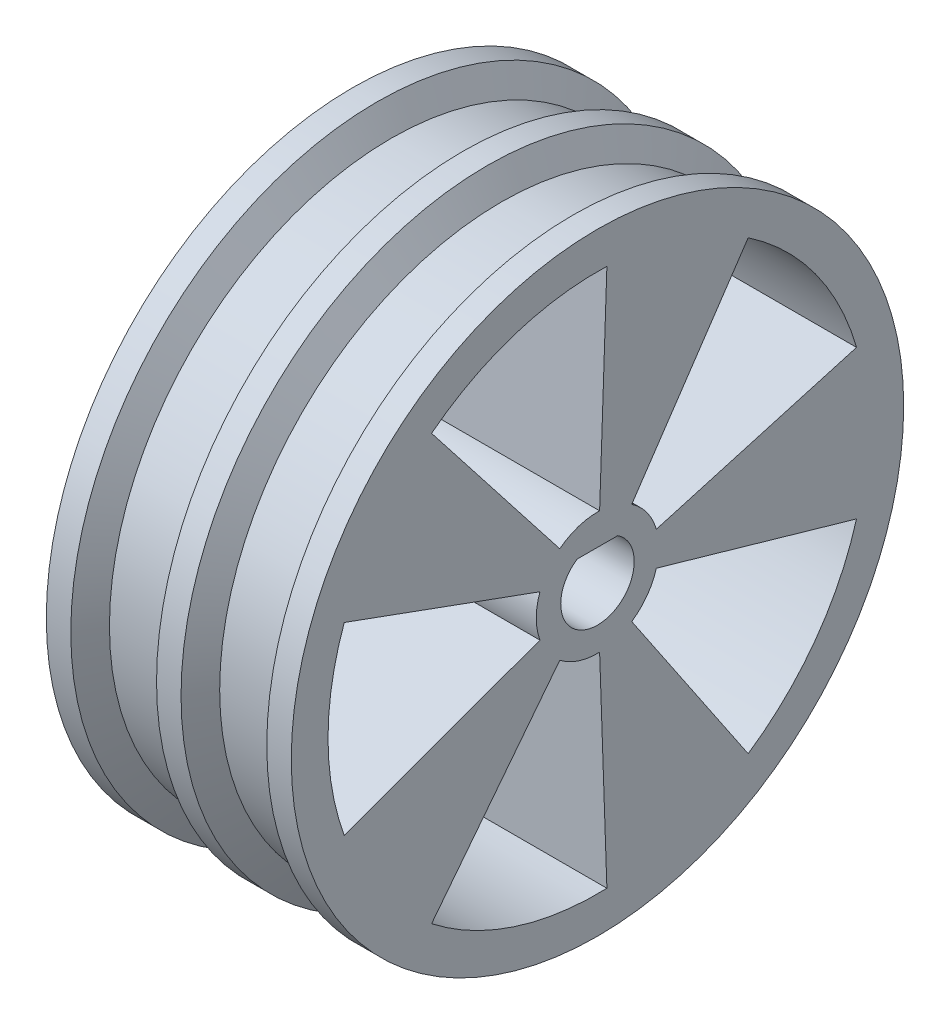
ISO-10303-21;
HEADER;
FILE_DESCRIPTION(('STEP AP214'),'2;1');
FILE_NAME('part.step','',(''),(''),'','','');
FILE_SCHEMA(('AUTOMOTIVE_DESIGN { 1 0 10303 214 1 1 1 1 }'));
ENDSEC;
DATA;
#1=APPLICATION_CONTEXT('core data for automotive mechanical design processes');
#2=APPLICATION_PROTOCOL_DEFINITION('international standard','automotive_design',2000,#1);
#3=PRODUCT_CONTEXT('',#1,'mechanical');
#4=PRODUCT('Part','Part','',(#3));
#5=PRODUCT_RELATED_PRODUCT_CATEGORY('part','',(#4));
#6=PRODUCT_DEFINITION_FORMATION('','',#4);
#7=PRODUCT_DEFINITION_CONTEXT('part definition',#1,'design');
#8=PRODUCT_DEFINITION('design','',#6,#7);
#9=PRODUCT_DEFINITION_SHAPE('','',#8);
#10=(LENGTH_UNIT() NAMED_UNIT(*) SI_UNIT(.MILLI.,.METRE.));
#11=(NAMED_UNIT(*) PLANE_ANGLE_UNIT() SI_UNIT($,.RADIAN.));
#12=(NAMED_UNIT(*) SI_UNIT($,.STERADIAN.) SOLID_ANGLE_UNIT());
#13=UNCERTAINTY_MEASURE_WITH_UNIT(LENGTH_MEASURE(1.E-05),#10,'distance_accuracy_value','');
#14=(GEOMETRIC_REPRESENTATION_CONTEXT(3) GLOBAL_UNCERTAINTY_ASSIGNED_CONTEXT((#13)) GLOBAL_UNIT_ASSIGNED_CONTEXT((#10,
#11,#12)) REPRESENTATION_CONTEXT('',''));
#15=CARTESIAN_POINT('',(0.,0.,0.));
#16=DIRECTION('',(0.,0.,1.));
#17=DIRECTION('',(1.,0.,0.));
#18=AXIS2_PLACEMENT_3D('',#15,#16,#17);
#19=CARTESIAN_POINT('',(-10.,2.5,1.6583123951777));
#20=DIRECTION('',(0.,1.,0.));
#21=DIRECTION('',(0.,0.,1.));
#22=AXIS2_PLACEMENT_3D('',#19,#20,#21);
#23=PLANE('',#22);
#24=DIRECTION('',(0.,0.,1.));
#25=VECTOR('',#24,1.);
#26=CARTESIAN_POINT('',(-6.,2.5,1.6583123951777));
#27=LINE('',#26,#25);
#28=CARTESIAN_POINT('',(-6.,2.5,-1.6583123951777));
#29=VERTEX_POINT('',#28);
#30=CARTESIAN_POINT('',(-6.,2.5,1.6583123951777));
#31=VERTEX_POINT('',#30);
#32=EDGE_CURVE('E227',#29,#31,#27,.T.);
#33=ORIENTED_EDGE('',*,*,#32,.F.);
#34=DIRECTION('',(1.,0.,0.));
#35=VECTOR('',#34,1.);
#36=CARTESIAN_POINT('',(-10.,2.5,-1.6583123951777));
#37=LINE('',#36,#35);
#38=CARTESIAN_POINT('',(10.,2.5,-1.6583123951777));
#39=VERTEX_POINT('',#38);
#40=EDGE_CURVE('E241',#29,#39,#37,.T.);
#41=ORIENTED_EDGE('',*,*,#40,.T.);
#42=DIRECTION('',(0.,0.,1.));
#43=VECTOR('',#42,1.);
#44=CARTESIAN_POINT('',(10.,2.5,1.6583123951777));
#45=LINE('',#44,#43);
#46=CARTESIAN_POINT('',(10.,2.5,1.6583123951777));
#47=VERTEX_POINT('',#46);
#48=EDGE_CURVE('E245',#39,#47,#45,.T.);
#49=ORIENTED_EDGE('',*,*,#48,.T.);
#50=DIRECTION('',(1.,0.,0.));
#51=VECTOR('',#50,1.);
#52=CARTESIAN_POINT('',(-10.,2.5,1.6583123951777));
#53=LINE('',#52,#51);
#54=EDGE_CURVE('E239',#31,#47,#53,.T.);
#55=ORIENTED_EDGE('',*,*,#54,.F.);
#56=EDGE_LOOP('',(#33,#41,#49,#55));
#57=FACE_BOUND('',#56,.T.);
#58=ADVANCED_FACE('F81',(#57),#23,.F.);
#59=CARTESIAN_POINT('',(-10.,0.,0.));
#60=DIRECTION('',(1.,0.,0.));
#61=DIRECTION('',(0.,0.,-1.));
#62=AXIS2_PLACEMENT_3D('',#59,#60,#61);
#63=PLANE('',#62);
#64=CARTESIAN_POINT('',(-10.,0.,0.));
#65=DIRECTION('',(1.,0.,0.));
#66=DIRECTION('',(0.,0.,-1.));
#67=AXIS2_PLACEMENT_3D('',#64,#65,#66);
#68=CIRCLE('',#67,5.);
#69=CARTESIAN_POINT('',(-10.,-4.99695413509548,-0.174497483512452));
#70=VERTEX_POINT('',#69);
#71=CARTESIAN_POINT('',(-10.,-3.94005376803357,3.07830737662834));
#72=VERTEX_POINT('',#71);
#73=EDGE_CURVE('E791',#70,#72,#68,.F.);
#74=ORIENTED_EDGE('',*,*,#73,.T.);
#75=DIRECTION('',(0.,0.788010753606723,-0.615661475325657));
#76=VECTOR('',#75,1.);
#77=CARTESIAN_POINT('',(-10.,0.,0.));
#78=LINE('',#77,#76);
#79=CARTESIAN_POINT('',(-10.,-17.3362365793479,13.5445524571645));
#80=VERTEX_POINT('',#79);
#81=EDGE_CURVE('E772',#80,#72,#78,.T.);
#82=ORIENTED_EDGE('',*,*,#81,.F.);
#83=CARTESIAN_POINT('',(-10.,0.,0.));
#84=DIRECTION('',(1.,0.,0.));
#85=DIRECTION('',(0.,0.,-1.));
#86=AXIS2_PLACEMENT_3D('',#83,#84,#85);
#87=CIRCLE('',#86,22.);
#88=CARTESIAN_POINT('',(-10.,-21.9865981944201,-0.767788927455052));
#89=VERTEX_POINT('',#88);
#90=EDGE_CURVE('E764',#89,#80,#87,.F.);
#91=ORIENTED_EDGE('',*,*,#90,.F.);
#92=DIRECTION('',(0.,0.999390827019096,0.0348994967025059));
#93=VECTOR('',#92,1.);
#94=CARTESIAN_POINT('',(-10.,0.,0.));
#95=LINE('',#94,#93);
#96=EDGE_CURVE('E782',#89,#70,#95,.T.);
#97=ORIENTED_EDGE('',*,*,#96,.T.);
#98=EDGE_LOOP('',(#74,#82,#91,#97));
#99=FACE_BOUND('',#98,.T.);
#100=CARTESIAN_POINT('',(-10.,0.,0.));
#101=DIRECTION('',(1.,0.,0.));
#102=DIRECTION('',(0.,0.,-1.));
#103=AXIS2_PLACEMENT_3D('',#100,#101,#102);
#104=CIRCLE('',#103,5.);
#105=CARTESIAN_POINT('',(-10.,-1.37818677908506,-4.8063084796917));
#106=VERTEX_POINT('',#105);
#107=CARTESIAN_POINT('',(-10.,-4.14518786277518,-2.79596451735377));
#108=VERTEX_POINT('',#107);
#109=EDGE_CURVE('E766',#106,#108,#104,.F.);
#110=ORIENTED_EDGE('',*,*,#109,.T.);
#111=DIRECTION('',(0.,0.829037572555044,0.559192903470743));
#112=VECTOR('',#111,1.);
#113=CARTESIAN_POINT('',(-10.,0.,0.));
#114=LINE('',#113,#112);
#115=CARTESIAN_POINT('',(-10.,-18.2388265962109,-12.3022438763564));
#116=VERTEX_POINT('',#115);
#117=EDGE_CURVE('E744',#116,#108,#114,.T.);
#118=ORIENTED_EDGE('',*,*,#117,.F.);
#119=CARTESIAN_POINT('',(-10.,0.,0.));
#120=DIRECTION('',(1.,0.,0.));
#121=DIRECTION('',(0.,0.,-1.));
#122=AXIS2_PLACEMENT_3D('',#119,#120,#121);
#123=CIRCLE('',#122,22.);
#124=CARTESIAN_POINT('',(-10.,-6.06402182797396,-21.147757310643));
#125=VERTEX_POINT('',#124);
#126=EDGE_CURVE('E736',#125,#116,#123,.F.);
#127=ORIENTED_EDGE('',*,*,#126,.F.);
#128=DIRECTION('',(0.,0.275637355816996,0.96126169593832));
#129=VECTOR('',#128,1.);
#130=CARTESIAN_POINT('',(-10.,0.,0.));
#131=LINE('',#130,#129);
#132=EDGE_CURVE('E755',#125,#106,#131,.T.);
#133=ORIENTED_EDGE('',*,*,#132,.T.);
#134=EDGE_LOOP('',(#110,#118,#127,#133));
#135=FACE_BOUND('',#134,.T.);
#136=CARTESIAN_POINT('',(-10.,0.,0.));
#137=DIRECTION('',(1.,0.,0.));
#138=DIRECTION('',(0.,0.,-1.));
#139=AXIS2_PLACEMENT_3D('',#136,#137,#138);
#140=CIRCLE('',#139,5.);
#141=CARTESIAN_POINT('',(-10.,4.14518786277522,-2.79596451735385));
#142=VERTEX_POINT('',#141);
#143=CARTESIAN_POINT('',(-10.,1.37818677908497,-4.8063084796916));
#144=VERTEX_POINT('',#143);
#145=EDGE_CURVE('E738',#142,#144,#140,.F.);
#146=ORIENTED_EDGE('',*,*,#145,.T.);
#147=DIRECTION('',(0.,-0.275637355816999,0.961261695938319));
#148=VECTOR('',#147,1.);
#149=CARTESIAN_POINT('',(-10.,0.,0.));
#150=LINE('',#149,#148);
#151=CARTESIAN_POINT('',(-10.,6.06402182797396,-21.147757310643));
#152=VERTEX_POINT('',#151);
#153=EDGE_CURVE('E691',#152,#144,#150,.T.);
#154=ORIENTED_EDGE('',*,*,#153,.F.);
#155=CARTESIAN_POINT('',(-10.,0.,0.));
#156=DIRECTION('',(1.,0.,0.));
#157=DIRECTION('',(0.,0.,-1.));
#158=AXIS2_PLACEMENT_3D('',#155,#156,#157);
#159=CIRCLE('',#158,22.);
#160=CARTESIAN_POINT('',(-10.,18.2388265962109,-12.3022438763564));
#161=VERTEX_POINT('',#160);
#162=EDGE_CURVE('E687',#161,#152,#159,.F.);
#163=ORIENTED_EDGE('',*,*,#162,.F.);
#164=DIRECTION('',(0.,-0.829037572555046,0.559192903470741));
#165=VECTOR('',#164,1.);
#166=CARTESIAN_POINT('',(-10.,0.,-1.04985018589199E-13));
#167=LINE('',#166,#165);
#168=EDGE_CURVE('E727',#161,#142,#167,.T.);
#169=ORIENTED_EDGE('',*,*,#168,.T.);
#170=EDGE_LOOP('',(#146,#154,#163,#169));
#171=FACE_BOUND('',#170,.T.);
#172=CARTESIAN_POINT('',(-10.,0.,0.));
#173=DIRECTION('',(1.,0.,0.));
#174=DIRECTION('',(0.,0.,-1.));
#175=AXIS2_PLACEMENT_3D('',#172,#173,#174);
#176=CIRCLE('',#175,5.);
#177=CARTESIAN_POINT('',(-10.,3.9400537680336,3.0783073766283));
#178=VERTEX_POINT('',#177);
#179=CARTESIAN_POINT('',(-10.,4.99695413509548,-0.174497483512522));
#180=VERTEX_POINT('',#179);
#181=EDGE_CURVE('E709',#178,#180,#176,.F.);
#182=ORIENTED_EDGE('',*,*,#181,.T.);
#183=DIRECTION('',(0.,-0.999390827019096,0.0348994967025015));
#184=VECTOR('',#183,1.);
#185=CARTESIAN_POINT('',(-10.,0.,0.));
#186=LINE('',#185,#184);
#187=CARTESIAN_POINT('',(-10.,21.9865981944201,-0.767788927455048));
#188=VERTEX_POINT('',#187);
#189=EDGE_CURVE('E694',#188,#180,#186,.T.);
#190=ORIENTED_EDGE('',*,*,#189,.F.);
#191=CARTESIAN_POINT('',(-10.,0.,0.));
#192=DIRECTION('',(1.,0.,0.));
#193=DIRECTION('',(0.,0.,-1.));
#194=AXIS2_PLACEMENT_3D('',#191,#192,#193);
#195=CIRCLE('',#194,22.);
#196=CARTESIAN_POINT('',(-10.,17.3362365793479,13.5445524571645));
#197=VERTEX_POINT('',#196);
#198=EDGE_CURVE('E360',#197,#188,#195,.F.);
#199=ORIENTED_EDGE('',*,*,#198,.F.);
#200=DIRECTION('',(0.,-0.788010753606721,-0.615661475325659));
#201=VECTOR('',#200,1.);
#202=CARTESIAN_POINT('',(-10.,0.,0.));
#203=LINE('',#202,#201);
#204=EDGE_CURVE('E702',#197,#178,#203,.T.);
#205=ORIENTED_EDGE('',*,*,#204,.T.);
#206=EDGE_LOOP('',(#182,#190,#199,#205));
#207=FACE_BOUND('',#206,.T.);
#208=CARTESIAN_POINT('',(-10.,0.,0.));
#209=DIRECTION('',(1.,0.,0.));
#210=DIRECTION('',(0.,0.,-1.));
#211=AXIS2_PLACEMENT_3D('',#208,#209,#210);
#212=CIRCLE('',#211,25.);
#213=CARTESIAN_POINT('',(-10.,0.,-25.));
#214=VERTEX_POINT('',#213);
#215=EDGE_CURVE('E233',#214,#214,#212,.T.);
#216=ORIENTED_EDGE('',*,*,#215,.F.);
#217=EDGE_LOOP('',(#216));
#218=FACE_BOUND('',#217,.T.);
#219=CARTESIAN_POINT('',(-10.,0.,0.));
#220=DIRECTION('',(1.,0.,0.));
#221=DIRECTION('',(0.,0.,-1.));
#222=AXIS2_PLACEMENT_3D('',#219,#220,#221);
#223=CIRCLE('',#222,3.);
#224=CARTESIAN_POINT('',(-10.,0.,-3.));
#225=VERTEX_POINT('',#224);
#226=EDGE_CURVE('E250',#225,#225,#223,.T.);
#227=ORIENTED_EDGE('',*,*,#226,.T.);
#228=EDGE_LOOP('',(#227));
#229=FACE_BOUND('',#228,.T.);
#230=DIRECTION('',(0.,0.34202014332567,-0.939692620785908));
#231=VECTOR('',#230,1.);
#232=CARTESIAN_POINT('',(-10.,0.,0.));
#233=LINE('',#232,#231);
#234=CARTESIAN_POINT('',(-10.,-7.52444315316474,20.67323765729));
#235=VERTEX_POINT('',#234);
#236=CARTESIAN_POINT('',(-10.,-1.71010071662835,4.69846310392954));
#237=VERTEX_POINT('',#236);
#238=EDGE_CURVE('E333',#235,#237,#233,.T.);
#239=ORIENTED_EDGE('',*,*,#238,.T.);
#240=CARTESIAN_POINT('',(-10.,0.,0.));
#241=DIRECTION('',(1.,0.,0.));
#242=DIRECTION('',(0.,0.,-1.));
#243=AXIS2_PLACEMENT_3D('',#240,#241,#242);
#244=CIRCLE('',#243,5.);
#245=CARTESIAN_POINT('',(-10.,1.71010071662835,4.69846310392954));
#246=VERTEX_POINT('',#245);
#247=EDGE_CURVE('E335',#237,#246,#244,.F.);
#248=ORIENTED_EDGE('',*,*,#247,.T.);
#249=DIRECTION('',(0.,-0.34202014332567,-0.939692620785908));
#250=VECTOR('',#249,1.);
#251=CARTESIAN_POINT('',(-10.,0.,0.));
#252=LINE('',#251,#250);
#253=CARTESIAN_POINT('',(-10.,7.52444315316474,20.67323765729));
#254=VERTEX_POINT('',#253);
#255=EDGE_CURVE('E341',#254,#246,#252,.T.);
#256=ORIENTED_EDGE('',*,*,#255,.F.);
#257=CARTESIAN_POINT('',(-10.,0.,0.));
#258=DIRECTION('',(1.,0.,0.));
#259=DIRECTION('',(0.,0.,-1.));
#260=AXIS2_PLACEMENT_3D('',#257,#258,#259);
#261=CIRCLE('',#260,22.);
#262=EDGE_CURVE('E336',#235,#254,#261,.F.);
#263=ORIENTED_EDGE('',*,*,#262,.F.);
#264=EDGE_LOOP('',(#239,#248,#256,#263));
#265=FACE_BOUND('',#264,.T.);
#266=ADVANCED_FACE('F279',(#99,#135,#171,#207,#218,#229,#265),#63,.F.);
#267=CARTESIAN_POINT('',(10.,0.,0.));
#268=DIRECTION('',(1.,0.,0.));
#269=DIRECTION('',(0.,0.,-1.));
#270=AXIS2_PLACEMENT_3D('',#267,#268,#269);
#271=PLANE('',#270);
#272=DIRECTION('',(0.,-0.788010753606723,0.615661475325657));
#273=VECTOR('',#272,1.);
#274=CARTESIAN_POINT('',(10.,0.,0.));
#275=LINE('',#274,#273);
#276=CARTESIAN_POINT('',(10.,-3.94005376803357,3.07830737662834));
#277=VERTEX_POINT('',#276);
#278=CARTESIAN_POINT('',(10.,-17.3362365793479,13.5445524571645));
#279=VERTEX_POINT('',#278);
#280=EDGE_CURVE('E242',#277,#279,#275,.T.);
#281=ORIENTED_EDGE('',*,*,#280,.F.);
#282=CARTESIAN_POINT('',(10.,0.,0.));
#283=DIRECTION('',(1.,0.,0.));
#284=DIRECTION('',(0.,0.,-1.));
#285=AXIS2_PLACEMENT_3D('',#282,#283,#284);
#286=CIRCLE('',#285,5.);
#287=CARTESIAN_POINT('',(10.,-4.99695413509548,-0.174497483512452));
#288=VERTEX_POINT('',#287);
#289=EDGE_CURVE('E776',#277,#288,#286,.T.);
#290=ORIENTED_EDGE('',*,*,#289,.T.);
#291=DIRECTION('',(0.,-0.999390827019096,-0.0348994967025059));
#292=VECTOR('',#291,1.);
#293=CARTESIAN_POINT('',(10.,0.,0.));
#294=LINE('',#293,#292);
#295=CARTESIAN_POINT('',(10.,-21.9865981944201,-0.767788927455052));
#296=VERTEX_POINT('',#295);
#297=EDGE_CURVE('E784',#288,#296,#294,.T.);
#298=ORIENTED_EDGE('',*,*,#297,.T.);
#299=CARTESIAN_POINT('',(10.,0.,0.));
#300=DIRECTION('',(1.,0.,0.));
#301=DIRECTION('',(0.,0.,-1.));
#302=AXIS2_PLACEMENT_3D('',#299,#300,#301);
#303=CIRCLE('',#302,22.);
#304=EDGE_CURVE('E787',#279,#296,#303,.T.);
#305=ORIENTED_EDGE('',*,*,#304,.F.);
#306=EDGE_LOOP('',(#281,#290,#298,#305));
#307=FACE_BOUND('',#306,.T.);
#308=DIRECTION('',(0.,-0.829037572555044,-0.559192903470743));
#309=VECTOR('',#308,1.);
#310=CARTESIAN_POINT('',(10.,0.,0.));
#311=LINE('',#310,#309);
#312=CARTESIAN_POINT('',(10.,-4.14518786277528,-2.79596451735384));
#313=VERTEX_POINT('',#312);
#314=CARTESIAN_POINT('',(10.,-18.2388265962109,-12.3022438763564));
#315=VERTEX_POINT('',#314);
#316=EDGE_CURVE('E669',#313,#315,#311,.T.);
#317=ORIENTED_EDGE('',*,*,#316,.F.);
#318=CARTESIAN_POINT('',(10.,0.,0.));
#319=DIRECTION('',(1.,0.,0.));
#320=DIRECTION('',(0.,0.,-1.));
#321=AXIS2_PLACEMENT_3D('',#318,#319,#320);
#322=CIRCLE('',#321,5.);
#323=CARTESIAN_POINT('',(10.,-1.37818677908506,-4.8063084796917));
#324=VERTEX_POINT('',#323);
#325=EDGE_CURVE('E749',#313,#324,#322,.T.);
#326=ORIENTED_EDGE('',*,*,#325,.T.);
#327=DIRECTION('',(0.,-0.275637355816996,-0.96126169593832));
#328=VECTOR('',#327,1.);
#329=CARTESIAN_POINT('',(10.,0.,0.));
#330=LINE('',#329,#328);
#331=CARTESIAN_POINT('',(10.,-6.06402182797396,-21.147757310643));
#332=VERTEX_POINT('',#331);
#333=EDGE_CURVE('E757',#324,#332,#330,.T.);
#334=ORIENTED_EDGE('',*,*,#333,.T.);
#335=CARTESIAN_POINT('',(10.,0.,0.));
#336=DIRECTION('',(1.,0.,0.));
#337=DIRECTION('',(0.,0.,-1.));
#338=AXIS2_PLACEMENT_3D('',#335,#336,#337);
#339=CIRCLE('',#338,22.);
#340=EDGE_CURVE('E760',#315,#332,#339,.T.);
#341=ORIENTED_EDGE('',*,*,#340,.F.);
#342=EDGE_LOOP('',(#317,#326,#334,#341));
#343=FACE_BOUND('',#342,.T.);
#344=DIRECTION('',(0.,0.275637355816999,-0.961261695938319));
#345=VECTOR('',#344,1.);
#346=CARTESIAN_POINT('',(10.,0.,0.));
#347=LINE('',#346,#345);
#348=CARTESIAN_POINT('',(10.,1.378186779085,-4.80630847969172));
#349=VERTEX_POINT('',#348);
#350=CARTESIAN_POINT('',(10.,6.06402182797396,-21.147757310643));
#351=VERTEX_POINT('',#350);
#352=EDGE_CURVE('E674',#349,#351,#347,.T.);
#353=ORIENTED_EDGE('',*,*,#352,.F.);
#354=CARTESIAN_POINT('',(10.,0.,0.));
#355=DIRECTION('',(1.,0.,0.));
#356=DIRECTION('',(0.,0.,-1.));
#357=AXIS2_PLACEMENT_3D('',#354,#355,#356);
#358=CIRCLE('',#357,5.);
#359=CARTESIAN_POINT('',(10.,4.14518786277522,-2.79596451735385));
#360=VERTEX_POINT('',#359);
#361=EDGE_CURVE('E721',#349,#360,#358,.T.);
#362=ORIENTED_EDGE('',*,*,#361,.T.);
#363=DIRECTION('',(0.,0.829037572555046,-0.559192903470741));
#364=VECTOR('',#363,1.);
#365=CARTESIAN_POINT('',(10.,0.,-1.04985018589199E-13));
#366=LINE('',#365,#364);
#367=CARTESIAN_POINT('',(10.,18.2388265962109,-12.3022438763564));
#368=VERTEX_POINT('',#367);
#369=EDGE_CURVE('E729',#360,#368,#366,.T.);
#370=ORIENTED_EDGE('',*,*,#369,.T.);
#371=CARTESIAN_POINT('',(10.,0.,0.));
#372=DIRECTION('',(1.,0.,0.));
#373=DIRECTION('',(0.,0.,-1.));
#374=AXIS2_PLACEMENT_3D('',#371,#372,#373);
#375=CIRCLE('',#374,22.);
#376=EDGE_CURVE('E732',#351,#368,#375,.T.);
#377=ORIENTED_EDGE('',*,*,#376,.F.);
#378=EDGE_LOOP('',(#353,#362,#370,#377));
#379=FACE_BOUND('',#378,.T.);
#380=DIRECTION('',(0.,0.999390827019096,-0.0348994967025015));
#381=VECTOR('',#380,1.);
#382=CARTESIAN_POINT('',(10.,0.,0.));
#383=LINE('',#382,#381);
#384=CARTESIAN_POINT('',(10.,4.99695413509548,-0.174497483512522));
#385=VERTEX_POINT('',#384);
#386=CARTESIAN_POINT('',(10.,21.9865981944201,-0.767788927455049));
#387=VERTEX_POINT('',#386);
#388=EDGE_CURVE('E679',#385,#387,#383,.T.);
#389=ORIENTED_EDGE('',*,*,#388,.F.);
#390=CARTESIAN_POINT('',(10.,0.,0.));
#391=DIRECTION('',(1.,0.,0.));
#392=DIRECTION('',(0.,0.,-1.));
#393=AXIS2_PLACEMENT_3D('',#390,#391,#392);
#394=CIRCLE('',#393,5.);
#395=CARTESIAN_POINT('',(10.,3.9400537680336,3.0783073766283));
#396=VERTEX_POINT('',#395);
#397=EDGE_CURVE('E682',#385,#396,#394,.T.);
#398=ORIENTED_EDGE('',*,*,#397,.T.);
#399=DIRECTION('',(0.,0.788010753606721,0.615661475325659));
#400=VECTOR('',#399,1.);
#401=CARTESIAN_POINT('',(10.,0.,0.));
#402=LINE('',#401,#400);
#403=CARTESIAN_POINT('',(10.,17.3362365793479,13.5445524571645));
#404=VERTEX_POINT('',#403);
#405=EDGE_CURVE('E689',#396,#404,#402,.T.);
#406=ORIENTED_EDGE('',*,*,#405,.T.);
#407=CARTESIAN_POINT('',(10.,0.,0.));
#408=DIRECTION('',(1.,0.,0.));
#409=DIRECTION('',(0.,0.,-1.));
#410=AXIS2_PLACEMENT_3D('',#407,#408,#409);
#411=CIRCLE('',#410,22.);
#412=EDGE_CURVE('E684',#387,#404,#411,.T.);
#413=ORIENTED_EDGE('',*,*,#412,.F.);
#414=EDGE_LOOP('',(#389,#398,#406,#413));
#415=FACE_BOUND('',#414,.T.);
#416=ORIENTED_EDGE('',*,*,#48,.F.);
#417=CARTESIAN_POINT('',(10.,0.,0.));
#418=DIRECTION('',(1.,0.,0.));
#419=DIRECTION('',(0.,0.,-1.));
#420=AXIS2_PLACEMENT_3D('',#417,#418,#419);
#421=CIRCLE('',#420,3.);
#422=EDGE_CURVE('E313',#47,#39,#421,.T.);
#423=ORIENTED_EDGE('',*,*,#422,.F.);
#424=EDGE_LOOP('',(#416,#423));
#425=FACE_BOUND('',#424,.T.);
#426=CARTESIAN_POINT('',(10.,0.,0.));
#427=DIRECTION('',(1.,0.,0.));
#428=DIRECTION('',(0.,0.,-1.));
#429=AXIS2_PLACEMENT_3D('',#426,#427,#428);
#430=CIRCLE('',#429,25.);
#431=CARTESIAN_POINT('',(10.,0.,-25.));
#432=VERTEX_POINT('',#431);
#433=EDGE_CURVE('E321',#432,#432,#430,.T.);
#434=ORIENTED_EDGE('',*,*,#433,.T.);
#435=EDGE_LOOP('',(#434));
#436=FACE_BOUND('',#435,.T.);
#437=CARTESIAN_POINT('',(10.,0.,0.));
#438=DIRECTION('',(1.,0.,0.));
#439=DIRECTION('',(0.,0.,-1.));
#440=AXIS2_PLACEMENT_3D('',#437,#438,#439);
#441=CIRCLE('',#440,5.);
#442=CARTESIAN_POINT('',(10.,1.71010071662835,4.69846310392954));
#443=VERTEX_POINT('',#442);
#444=CARTESIAN_POINT('',(10.,-1.71010071662835,4.69846310392954));
#445=VERTEX_POINT('',#444);
#446=EDGE_CURVE('E363',#443,#445,#441,.T.);
#447=ORIENTED_EDGE('',*,*,#446,.T.);
#448=DIRECTION('',(0.,-0.34202014332567,0.939692620785908));
#449=VECTOR('',#448,1.);
#450=CARTESIAN_POINT('',(10.,0.,0.));
#451=LINE('',#450,#449);
#452=CARTESIAN_POINT('',(10.,-7.52444315316474,20.67323765729));
#453=VERTEX_POINT('',#452);
#454=EDGE_CURVE('E359',#445,#453,#451,.T.);
#455=ORIENTED_EDGE('',*,*,#454,.T.);
#456=CARTESIAN_POINT('',(10.,0.,0.));
#457=DIRECTION('',(1.,0.,0.));
#458=DIRECTION('',(0.,0.,-1.));
#459=AXIS2_PLACEMENT_3D('',#456,#457,#458);
#460=CIRCLE('',#459,22.);
#461=CARTESIAN_POINT('',(10.,7.52444315316474,20.67323765729));
#462=VERTEX_POINT('',#461);
#463=EDGE_CURVE('E356',#462,#453,#460,.T.);
#464=ORIENTED_EDGE('',*,*,#463,.F.);
#465=DIRECTION('',(0.,0.34202014332567,0.939692620785908));
#466=VECTOR('',#465,1.);
#467=CARTESIAN_POINT('',(10.,0.,0.));
#468=LINE('',#467,#466);
#469=EDGE_CURVE('E366',#443,#462,#468,.T.);
#470=ORIENTED_EDGE('',*,*,#469,.F.);
#471=EDGE_LOOP('',(#447,#455,#464,#470));
#472=FACE_BOUND('',#471,.T.);
#473=ADVANCED_FACE('F284',(#307,#343,#379,#415,#425,#436,#472),#271,.T.);
#474=CARTESIAN_POINT('',(-10.,0.,0.));
#475=DIRECTION('',(1.,0.,0.));
#476=DIRECTION('',(0.,0.,-1.));
#477=AXIS2_PLACEMENT_3D('',#474,#475,#476);
#478=CYLINDRICAL_SURFACE('',#477,25.);
#479=CARTESIAN_POINT('',(-1.,0.,0.));
#480=DIRECTION('',(-1.,0.,0.));
#481=DIRECTION('',(0.,0.,1.));
#482=AXIS2_PLACEMENT_3D('',#479,#480,#481);
#483=CIRCLE('',#482,25.);
#484=CARTESIAN_POINT('',(-1.,0.,25.));
#485=VERTEX_POINT('',#484);
#486=EDGE_CURVE('E310',#485,#485,#483,.T.);
#487=ORIENTED_EDGE('',*,*,#486,.F.);
#488=EDGE_LOOP('',(#487));
#489=FACE_BOUND('',#488,.T.);
#490=CARTESIAN_POINT('',(1.,0.,0.));
#491=DIRECTION('',(-1.,0.,0.));
#492=DIRECTION('',(0.,0.,1.));
#493=AXIS2_PLACEMENT_3D('',#490,#491,#492);
#494=CIRCLE('',#493,25.);
#495=CARTESIAN_POINT('',(1.,0.,25.));
#496=VERTEX_POINT('',#495);
#497=EDGE_CURVE('E311',#496,#496,#494,.T.);
#498=ORIENTED_EDGE('',*,*,#497,.T.);
#499=EDGE_LOOP('',(#498));
#500=FACE_BOUND('',#499,.T.);
#501=ADVANCED_FACE('F297',(#489,#500),#478,.T.);
#502=CARTESIAN_POINT('',(8.,0.,0.));
#503=DIRECTION('',(-1.,0.,0.));
#504=DIRECTION('',(0.,0.,1.));
#505=AXIS2_PLACEMENT_3D('',#502,#503,#504);
#506=CIRCLE('',#505,25.);
#507=CARTESIAN_POINT('',(8.,0.,25.));
#508=VERTEX_POINT('',#507);
#509=EDGE_CURVE('E316',#508,#508,#506,.T.);
#510=ORIENTED_EDGE('',*,*,#509,.F.);
#511=EDGE_LOOP('',(#510));
#512=FACE_BOUND('',#511,.T.);
#513=ORIENTED_EDGE('',*,*,#433,.F.);
#514=EDGE_LOOP('',(#513));
#515=FACE_BOUND('',#514,.T.);
#516=ADVANCED_FACE('F295',(#512,#515),#478,.T.);
#517=CARTESIAN_POINT('',(-8.,0.,0.));
#518=DIRECTION('',(-1.,0.,0.));
#519=DIRECTION('',(0.,0.,1.));
#520=AXIS2_PLACEMENT_3D('',#517,#518,#519);
#521=CIRCLE('',#520,25.);
#522=CARTESIAN_POINT('',(-8.,0.,25.));
#523=VERTEX_POINT('',#522);
#524=EDGE_CURVE('E309',#523,#523,#521,.T.);
#525=ORIENTED_EDGE('',*,*,#524,.T.);
#526=EDGE_LOOP('',(#525));
#527=FACE_BOUND('',#526,.T.);
#528=ORIENTED_EDGE('',*,*,#215,.T.);
#529=EDGE_LOOP('',(#528));
#530=FACE_BOUND('',#529,.T.);
#531=ADVANCED_FACE('F291',(#527,#530),#478,.T.);
#532=CARTESIAN_POINT('',(-10.,0.,0.));
#533=DIRECTION('',(1.,0.,0.));
#534=DIRECTION('',(0.,0.,-1.));
#535=AXIS2_PLACEMENT_3D('',#532,#533,#534);
#536=CYLINDRICAL_SURFACE('',#535,3.);
#537=CARTESIAN_POINT('',(-6.,0.,0.));
#538=DIRECTION('',(-1.,0.,0.));
#539=DIRECTION('',(0.,0.,1.));
#540=AXIS2_PLACEMENT_3D('',#537,#538,#539);
#541=CIRCLE('',#540,3.);
#542=EDGE_CURVE('E95',#31,#29,#541,.T.);
#543=ORIENTED_EDGE('',*,*,#542,.F.);
#544=ORIENTED_EDGE('',*,*,#54,.T.);
#545=ORIENTED_EDGE('',*,*,#422,.T.);
#546=ORIENTED_EDGE('',*,*,#40,.F.);
#547=EDGE_LOOP('',(#543,#544,#545,#546));
#548=FACE_BOUND('',#547,.T.);
#549=ORIENTED_EDGE('',*,*,#226,.F.);
#550=EDGE_LOOP('',(#549));
#551=FACE_BOUND('',#550,.T.);
#552=ADVANCED_FACE('F236',(#548,#551),#536,.F.);
#553=CARTESIAN_POINT('',(-1.,0.,0.));
#554=DIRECTION('',(-1.,0.,0.));
#555=DIRECTION('',(0.,0.,1.));
#556=AXIS2_PLACEMENT_3D('',#553,#554,#555);
#557=CYLINDRICAL_SURFACE('',#556,23.);
#558=CARTESIAN_POINT('',(-2.15470053837926,0.,0.));
#559=DIRECTION('',(-1.,0.,0.));
#560=DIRECTION('',(0.,0.,1.));
#561=AXIS2_PLACEMENT_3D('',#558,#559,#560);
#562=CIRCLE('',#561,23.);
#563=CARTESIAN_POINT('',(-2.15470053837926,0.,23.));
#564=VERTEX_POINT('',#563);
#565=EDGE_CURVE('E89',#564,#564,#562,.T.);
#566=ORIENTED_EDGE('',*,*,#565,.T.);
#567=EDGE_LOOP('',(#566));
#568=FACE_BOUND('',#567,.T.);
#569=CARTESIAN_POINT('',(-6.84529946162074,0.,0.));
#570=DIRECTION('',(-1.,0.,0.));
#571=DIRECTION('',(0.,0.,1.));
#572=AXIS2_PLACEMENT_3D('',#569,#570,#571);
#573=CIRCLE('',#572,23.);
#574=CARTESIAN_POINT('',(-6.84529946162074,0.,23.));
#575=VERTEX_POINT('',#574);
#576=EDGE_CURVE('E232',#575,#575,#573,.F.);
#577=ORIENTED_EDGE('',*,*,#576,.T.);
#578=EDGE_LOOP('',(#577));
#579=FACE_BOUND('',#578,.T.);
#580=ADVANCED_FACE('F262',(#568,#579),#557,.T.);
#581=CARTESIAN_POINT('',(1.,0.,0.));
#582=DIRECTION('',(1.,0.,0.));
#583=DIRECTION('',(0.,0.,-1.));
#584=AXIS2_PLACEMENT_3D('',#581,#582,#583);
#585=CYLINDRICAL_SURFACE('',#584,23.);
#586=CARTESIAN_POINT('',(2.15470053837926,0.,0.));
#587=DIRECTION('',(1.,0.,0.));
#588=DIRECTION('',(0.,0.,-1.));
#589=AXIS2_PLACEMENT_3D('',#586,#587,#588);
#590=CIRCLE('',#589,23.);
#591=CARTESIAN_POINT('',(2.15470053837926,0.,-23.));
#592=VERTEX_POINT('',#591);
#593=EDGE_CURVE('E12',#592,#592,#590,.T.);
#594=ORIENTED_EDGE('',*,*,#593,.T.);
#595=EDGE_LOOP('',(#594));
#596=FACE_BOUND('',#595,.T.);
#597=CARTESIAN_POINT('',(6.84529946162074,0.,0.));
#598=DIRECTION('',(1.,0.,0.));
#599=DIRECTION('',(0.,0.,-1.));
#600=AXIS2_PLACEMENT_3D('',#597,#598,#599);
#601=CIRCLE('',#600,23.);
#602=CARTESIAN_POINT('',(6.84529946162074,0.,-23.));
#603=VERTEX_POINT('',#602);
#604=EDGE_CURVE('E257',#603,#603,#601,.F.);
#605=ORIENTED_EDGE('',*,*,#604,.T.);
#606=EDGE_LOOP('',(#605));
#607=FACE_BOUND('',#606,.T.);
#608=ADVANCED_FACE('F394',(#596,#607),#585,.T.);
#609=CARTESIAN_POINT('',(-34.9212654929615,0.,0.));
#610=DIRECTION('',(0.,0.939692620785908,0.34202014332567));
#611=DIRECTION('',(0.,-0.34202014332567,0.939692620785908));
#612=AXIS2_PLACEMENT_3D('',#609,#610,#611);
#613=PLANE('',#612);
#614=DIRECTION('',(1.,0.,0.));
#615=VECTOR('',#614,1.);
#616=CARTESIAN_POINT('',(-34.9212654929615,-7.52444315316474,20.67323765729));
#617=LINE('',#616,#615);
#618=EDGE_CURVE('E347',#235,#453,#617,.T.);
#619=ORIENTED_EDGE('',*,*,#618,.T.);
#620=ORIENTED_EDGE('',*,*,#454,.F.);
#621=DIRECTION('',(1.,0.,0.));
#622=VECTOR('',#621,1.);
#623=CARTESIAN_POINT('',(-34.9212654929615,-1.71010071662835,4.69846310392954));
#624=LINE('',#623,#622);
#625=EDGE_CURVE('E368',#237,#445,#624,.T.);
#626=ORIENTED_EDGE('',*,*,#625,.F.);
#627=ORIENTED_EDGE('',*,*,#238,.F.);
#628=EDGE_LOOP('',(#619,#620,#626,#627));
#629=FACE_BOUND('',#628,.T.);
#630=ADVANCED_FACE('F372',(#629),#613,.T.);
#631=CARTESIAN_POINT('',(-34.9212654929615,0.,0.));
#632=DIRECTION('',(1.,0.,0.));
#633=DIRECTION('',(0.,0.,-1.));
#634=AXIS2_PLACEMENT_3D('',#631,#632,#633);
#635=CYLINDRICAL_SURFACE('',#634,5.);
#636=ORIENTED_EDGE('',*,*,#625,.T.);
#637=ORIENTED_EDGE('',*,*,#446,.F.);
#638=DIRECTION('',(1.,0.,0.));
#639=VECTOR('',#638,1.);
#640=CARTESIAN_POINT('',(-34.9212654929615,1.71010071662835,4.69846310392954));
#641=LINE('',#640,#639);
#642=EDGE_CURVE('E344',#246,#443,#641,.T.);
#643=ORIENTED_EDGE('',*,*,#642,.F.);
#644=ORIENTED_EDGE('',*,*,#247,.F.);
#645=EDGE_LOOP('',(#636,#637,#643,#644));
#646=FACE_BOUND('',#645,.T.);
#647=ADVANCED_FACE('F378',(#646),#635,.T.);
#648=CARTESIAN_POINT('',(-34.9212654929615,0.,0.));
#649=DIRECTION('',(0.,0.939692620785908,-0.34202014332567));
#650=DIRECTION('',(0.,0.34202014332567,0.939692620785908));
#651=AXIS2_PLACEMENT_3D('',#648,#649,#650);
#652=PLANE('',#651);
#653=ORIENTED_EDGE('',*,*,#255,.T.);
#654=ORIENTED_EDGE('',*,*,#642,.T.);
#655=ORIENTED_EDGE('',*,*,#469,.T.);
#656=DIRECTION('',(1.,0.,0.));
#657=VECTOR('',#656,1.);
#658=CARTESIAN_POINT('',(-34.9212654929615,7.52444315316474,20.67323765729));
#659=LINE('',#658,#657);
#660=EDGE_CURVE('E339',#254,#462,#659,.T.);
#661=ORIENTED_EDGE('',*,*,#660,.F.);
#662=EDGE_LOOP('',(#653,#654,#655,#661));
#663=FACE_BOUND('',#662,.T.);
#664=ADVANCED_FACE('F380',(#663),#652,.F.);
#665=CARTESIAN_POINT('',(-34.9212654929615,0.,0.));
#666=DIRECTION('',(1.,0.,0.));
#667=DIRECTION('',(0.,0.,-1.));
#668=AXIS2_PLACEMENT_3D('',#665,#666,#667);
#669=CYLINDRICAL_SURFACE('',#668,22.);
#670=ORIENTED_EDGE('',*,*,#262,.T.);
#671=ORIENTED_EDGE('',*,*,#660,.T.);
#672=ORIENTED_EDGE('',*,*,#463,.T.);
#673=ORIENTED_EDGE('',*,*,#618,.F.);
#674=EDGE_LOOP('',(#670,#671,#672,#673));
#675=FACE_BOUND('',#674,.T.);
#676=ADVANCED_FACE('F374',(#675),#669,.F.);
#677=CARTESIAN_POINT('',(-34.9212654929615,0.,0.));
#678=DIRECTION('',(0.,-0.0348994967025015,-0.999390827019096));
#679=DIRECTION('',(0.,0.999390827019096,-0.0348994967025015));
#680=AXIS2_PLACEMENT_3D('',#677,#678,#679);
#681=PLANE('',#680);
#682=ORIENTED_EDGE('',*,*,#189,.T.);
#683=DIRECTION('',(1.,0.,0.));
#684=VECTOR('',#683,1.);
#685=CARTESIAN_POINT('',(-34.9212654929615,4.99695413509548,-0.174497483512522));
#686=LINE('',#685,#684);
#687=EDGE_CURVE('E700',#180,#385,#686,.T.);
#688=ORIENTED_EDGE('',*,*,#687,.T.);
#689=ORIENTED_EDGE('',*,*,#388,.T.);
#690=DIRECTION('',(1.,0.,0.));
#691=VECTOR('',#690,1.);
#692=CARTESIAN_POINT('',(-34.9212654929615,21.9865981944201,-0.767788927455049));
#693=LINE('',#692,#691);
#694=EDGE_CURVE('E699',#188,#387,#693,.T.);
#695=ORIENTED_EDGE('',*,*,#694,.F.);
#696=EDGE_LOOP('',(#682,#688,#689,#695));
#697=FACE_BOUND('',#696,.T.);
#698=ADVANCED_FACE('F387',(#697),#681,.F.);
#699=CARTESIAN_POINT('',(-34.9212654929615,0.,0.));
#700=DIRECTION('',(1.,0.,0.));
#701=DIRECTION('',(0.,0.,-1.));
#702=AXIS2_PLACEMENT_3D('',#699,#700,#701);
#703=CYLINDRICAL_SURFACE('',#702,5.);
#704=DIRECTION('',(1.,0.,0.));
#705=VECTOR('',#704,1.);
#706=CARTESIAN_POINT('',(-34.9212654929615,3.9400537680336,3.0783073766283));
#707=LINE('',#706,#705);
#708=EDGE_CURVE('E703',#178,#396,#707,.T.);
#709=ORIENTED_EDGE('',*,*,#708,.T.);
#710=ORIENTED_EDGE('',*,*,#397,.F.);
#711=ORIENTED_EDGE('',*,*,#687,.F.);
#712=ORIENTED_EDGE('',*,*,#181,.F.);
#713=EDGE_LOOP('',(#709,#710,#711,#712));
#714=FACE_BOUND('',#713,.T.);
#715=ADVANCED_FACE('F436',(#714),#703,.T.);
#716=CARTESIAN_POINT('',(-34.9212654929615,0.,0.));
#717=DIRECTION('',(0.,0.615661475325659,-0.788010753606721));
#718=DIRECTION('',(0.,0.788010753606721,0.615661475325659));
#719=AXIS2_PLACEMENT_3D('',#716,#717,#718);
#720=PLANE('',#719);
#721=DIRECTION('',(1.,0.,0.));
#722=VECTOR('',#721,1.);
#723=CARTESIAN_POINT('',(-34.9212654929615,17.3362365793479,13.5445524571645));
#724=LINE('',#723,#722);
#725=EDGE_CURVE('E705',#197,#404,#724,.T.);
#726=ORIENTED_EDGE('',*,*,#725,.T.);
#727=ORIENTED_EDGE('',*,*,#405,.F.);
#728=ORIENTED_EDGE('',*,*,#708,.F.);
#729=ORIENTED_EDGE('',*,*,#204,.F.);
#730=EDGE_LOOP('',(#726,#727,#728,#729));
#731=FACE_BOUND('',#730,.T.);
#732=ADVANCED_FACE('F445',(#731),#720,.T.);
#733=CARTESIAN_POINT('',(-34.9212654929615,0.,0.));
#734=DIRECTION('',(1.,0.,0.));
#735=DIRECTION('',(0.,0.,-1.));
#736=AXIS2_PLACEMENT_3D('',#733,#734,#735);
#737=CYLINDRICAL_SURFACE('',#736,22.);
#738=ORIENTED_EDGE('',*,*,#198,.T.);
#739=ORIENTED_EDGE('',*,*,#694,.T.);
#740=ORIENTED_EDGE('',*,*,#412,.T.);
#741=ORIENTED_EDGE('',*,*,#725,.F.);
#742=EDGE_LOOP('',(#738,#739,#740,#741));
#743=FACE_BOUND('',#742,.T.);
#744=ADVANCED_FACE('F455',(#743),#737,.F.);
#745=CARTESIAN_POINT('',(-34.9212654929615,0.,0.));
#746=DIRECTION('',(0.,-0.961261695938319,-0.275637355816999));
#747=DIRECTION('',(0.,0.275637355816999,-0.961261695938319));
#748=AXIS2_PLACEMENT_3D('',#745,#746,#747);
#749=PLANE('',#748);
#750=ORIENTED_EDGE('',*,*,#153,.T.);
#751=DIRECTION('',(1.,0.,0.));
#752=VECTOR('',#751,1.);
#753=CARTESIAN_POINT('',(-34.9212654929615,1.378186779085,-4.80630847969172));
#754=LINE('',#753,#752);
#755=EDGE_CURVE('E725',#144,#349,#754,.T.);
#756=ORIENTED_EDGE('',*,*,#755,.T.);
#757=ORIENTED_EDGE('',*,*,#352,.T.);
#758=DIRECTION('',(1.,0.,0.));
#759=VECTOR('',#758,1.);
#760=CARTESIAN_POINT('',(-34.9212654929615,6.06402182797396,-21.147757310643));
#761=LINE('',#760,#759);
#762=EDGE_CURVE('E717',#152,#351,#761,.T.);
#763=ORIENTED_EDGE('',*,*,#762,.F.);
#764=EDGE_LOOP('',(#750,#756,#757,#763));
#765=FACE_BOUND('',#764,.T.);
#766=ADVANCED_FACE('F465',(#765),#749,.F.);
#767=CARTESIAN_POINT('',(-34.9212654929615,0.,0.));
#768=DIRECTION('',(1.,0.,0.));
#769=DIRECTION('',(0.,0.,-1.));
#770=AXIS2_PLACEMENT_3D('',#767,#768,#769);
#771=CYLINDRICAL_SURFACE('',#770,5.);
#772=DIRECTION('',(1.,0.,0.));
#773=VECTOR('',#772,1.);
#774=CARTESIAN_POINT('',(-34.9212654929615,4.14518786277522,-2.79596451735385));
#775=LINE('',#774,#773);
#776=EDGE_CURVE('E723',#142,#360,#775,.T.);
#777=ORIENTED_EDGE('',*,*,#776,.T.);
#778=ORIENTED_EDGE('',*,*,#361,.F.);
#779=ORIENTED_EDGE('',*,*,#755,.F.);
#780=ORIENTED_EDGE('',*,*,#145,.F.);
#781=EDGE_LOOP('',(#777,#778,#779,#780));
#782=FACE_BOUND('',#781,.T.);
#783=ADVANCED_FACE('F474',(#782),#771,.T.);
#784=CARTESIAN_POINT('',(-34.9212654929615,0.,-1.04985018589199E-13));
#785=DIRECTION('',(0.,-0.559192903470741,-0.829037572555046));
#786=DIRECTION('',(0.,0.829037572555046,-0.559192903470741));
#787=AXIS2_PLACEMENT_3D('',#784,#785,#786);
#788=PLANE('',#787);
#789=DIRECTION('',(1.,0.,0.));
#790=VECTOR('',#789,1.);
#791=CARTESIAN_POINT('',(-34.9212654929615,18.2388265962109,-12.3022438763564));
#792=LINE('',#791,#790);
#793=EDGE_CURVE('E720',#161,#368,#792,.T.);
#794=ORIENTED_EDGE('',*,*,#793,.T.);
#795=ORIENTED_EDGE('',*,*,#369,.F.);
#796=ORIENTED_EDGE('',*,*,#776,.F.);
#797=ORIENTED_EDGE('',*,*,#168,.F.);
#798=EDGE_LOOP('',(#794,#795,#796,#797));
#799=FACE_BOUND('',#798,.T.);
#800=ADVANCED_FACE('F484',(#799),#788,.T.);
#801=CARTESIAN_POINT('',(-34.9212654929615,0.,0.));
#802=DIRECTION('',(1.,0.,0.));
#803=DIRECTION('',(0.,0.,-1.));
#804=AXIS2_PLACEMENT_3D('',#801,#802,#803);
#805=CYLINDRICAL_SURFACE('',#804,22.);
#806=ORIENTED_EDGE('',*,*,#162,.T.);
#807=ORIENTED_EDGE('',*,*,#762,.T.);
#808=ORIENTED_EDGE('',*,*,#376,.T.);
#809=ORIENTED_EDGE('',*,*,#793,.F.);
#810=EDGE_LOOP('',(#806,#807,#808,#809));
#811=FACE_BOUND('',#810,.T.);
#812=ADVANCED_FACE('F494',(#811),#805,.F.);
#813=CARTESIAN_POINT('',(-34.9212654929615,0.,0.));
#814=DIRECTION('',(0.,-0.559192903470743,0.829037572555044));
#815=DIRECTION('',(0.,-0.829037572555044,-0.559192903470743));
#816=AXIS2_PLACEMENT_3D('',#813,#814,#815);
#817=PLANE('',#816);
#818=ORIENTED_EDGE('',*,*,#117,.T.);
#819=DIRECTION('',(1.,0.,0.));
#820=VECTOR('',#819,1.);
#821=CARTESIAN_POINT('',(-34.9212654929615,-4.14518786277528,-2.79596451735384));
#822=LINE('',#821,#820);
#823=EDGE_CURVE('E753',#108,#313,#822,.T.);
#824=ORIENTED_EDGE('',*,*,#823,.T.);
#825=ORIENTED_EDGE('',*,*,#316,.T.);
#826=DIRECTION('',(1.,0.,0.));
#827=VECTOR('',#826,1.);
#828=CARTESIAN_POINT('',(-34.9212654929615,-18.2388265962109,-12.3022438763564));
#829=LINE('',#828,#827);
#830=EDGE_CURVE('E745',#116,#315,#829,.T.);
#831=ORIENTED_EDGE('',*,*,#830,.F.);
#832=EDGE_LOOP('',(#818,#824,#825,#831));
#833=FACE_BOUND('',#832,.T.);
#834=ADVANCED_FACE('F504',(#833),#817,.F.);
#835=CARTESIAN_POINT('',(-34.9212654929615,0.,0.));
#836=DIRECTION('',(1.,0.,0.));
#837=DIRECTION('',(0.,0.,-1.));
#838=AXIS2_PLACEMENT_3D('',#835,#836,#837);
#839=CYLINDRICAL_SURFACE('',#838,5.);
#840=DIRECTION('',(1.,0.,0.));
#841=VECTOR('',#840,1.);
#842=CARTESIAN_POINT('',(-34.9212654929615,-1.37818677908506,-4.8063084796917));
#843=LINE('',#842,#841);
#844=EDGE_CURVE('E751',#106,#324,#843,.T.);
#845=ORIENTED_EDGE('',*,*,#844,.T.);
#846=ORIENTED_EDGE('',*,*,#325,.F.);
#847=ORIENTED_EDGE('',*,*,#823,.F.);
#848=ORIENTED_EDGE('',*,*,#109,.F.);
#849=EDGE_LOOP('',(#845,#846,#847,#848));
#850=FACE_BOUND('',#849,.T.);
#851=ADVANCED_FACE('F514',(#850),#839,.T.);
#852=CARTESIAN_POINT('',(-34.9212654929615,0.,0.));
#853=DIRECTION('',(0.,-0.96126169593832,0.275637355816996));
#854=DIRECTION('',(0.,-0.275637355816996,-0.96126169593832));
#855=AXIS2_PLACEMENT_3D('',#852,#853,#854);
#856=PLANE('',#855);
#857=DIRECTION('',(1.,0.,0.));
#858=VECTOR('',#857,1.);
#859=CARTESIAN_POINT('',(-34.9212654929615,-6.06402182797396,-21.147757310643));
#860=LINE('',#859,#858);
#861=EDGE_CURVE('E748',#125,#332,#860,.T.);
#862=ORIENTED_EDGE('',*,*,#861,.T.);
#863=ORIENTED_EDGE('',*,*,#333,.F.);
#864=ORIENTED_EDGE('',*,*,#844,.F.);
#865=ORIENTED_EDGE('',*,*,#132,.F.);
#866=EDGE_LOOP('',(#862,#863,#864,#865));
#867=FACE_BOUND('',#866,.T.);
#868=ADVANCED_FACE('F524',(#867),#856,.T.);
#869=CARTESIAN_POINT('',(-34.9212654929615,0.,0.));
#870=DIRECTION('',(1.,0.,0.));
#871=DIRECTION('',(0.,0.,-1.));
#872=AXIS2_PLACEMENT_3D('',#869,#870,#871);
#873=CYLINDRICAL_SURFACE('',#872,22.);
#874=ORIENTED_EDGE('',*,*,#126,.T.);
#875=ORIENTED_EDGE('',*,*,#830,.T.);
#876=ORIENTED_EDGE('',*,*,#340,.T.);
#877=ORIENTED_EDGE('',*,*,#861,.F.);
#878=EDGE_LOOP('',(#874,#875,#876,#877));
#879=FACE_BOUND('',#878,.T.);
#880=ADVANCED_FACE('F534',(#879),#873,.F.);
#881=CARTESIAN_POINT('',(-34.9212654929615,0.,0.));
#882=DIRECTION('',(0.,0.615661475325657,0.788010753606723));
#883=DIRECTION('',(0.,-0.788010753606723,0.615661475325657));
#884=AXIS2_PLACEMENT_3D('',#881,#882,#883);
#885=PLANE('',#884);
#886=ORIENTED_EDGE('',*,*,#81,.T.);
#887=DIRECTION('',(1.,0.,0.));
#888=VECTOR('',#887,1.);
#889=CARTESIAN_POINT('',(-34.9212654929615,-3.94005376803357,3.07830737662834));
#890=LINE('',#889,#888);
#891=EDGE_CURVE('E780',#72,#277,#890,.T.);
#892=ORIENTED_EDGE('',*,*,#891,.T.);
#893=ORIENTED_EDGE('',*,*,#280,.T.);
#894=DIRECTION('',(1.,0.,0.));
#895=VECTOR('',#894,1.);
#896=CARTESIAN_POINT('',(-34.9212654929615,-17.3362365793479,13.5445524571645));
#897=LINE('',#896,#895);
#898=EDGE_CURVE('E773',#80,#279,#897,.T.);
#899=ORIENTED_EDGE('',*,*,#898,.F.);
#900=EDGE_LOOP('',(#886,#892,#893,#899));
#901=FACE_BOUND('',#900,.T.);
#902=ADVANCED_FACE('F544',(#901),#885,.F.);
#903=CARTESIAN_POINT('',(-34.9212654929615,0.,0.));
#904=DIRECTION('',(1.,0.,0.));
#905=DIRECTION('',(0.,0.,-1.));
#906=AXIS2_PLACEMENT_3D('',#903,#904,#905);
#907=CYLINDRICAL_SURFACE('',#906,5.);
#908=DIRECTION('',(1.,0.,0.));
#909=VECTOR('',#908,1.);
#910=CARTESIAN_POINT('',(-34.9212654929615,-4.99695413509548,-0.174497483512452));
#911=LINE('',#910,#909);
#912=EDGE_CURVE('E778',#70,#288,#911,.T.);
#913=ORIENTED_EDGE('',*,*,#912,.T.);
#914=ORIENTED_EDGE('',*,*,#289,.F.);
#915=ORIENTED_EDGE('',*,*,#891,.F.);
#916=ORIENTED_EDGE('',*,*,#73,.F.);
#917=EDGE_LOOP('',(#913,#914,#915,#916));
#918=FACE_BOUND('',#917,.T.);
#919=ADVANCED_FACE('F554',(#918),#907,.T.);
#920=CARTESIAN_POINT('',(-34.9212654929615,0.,0.));
#921=DIRECTION('',(0.,-0.0348994967025059,0.999390827019095));
#922=DIRECTION('',(0.,-0.999390827019096,-0.0348994967025059));
#923=AXIS2_PLACEMENT_3D('',#920,#921,#922);
#924=PLANE('',#923);
#925=DIRECTION('',(1.,0.,0.));
#926=VECTOR('',#925,1.);
#927=CARTESIAN_POINT('',(-34.9212654929615,-21.9865981944201,-0.767788927455052));
#928=LINE('',#927,#926);
#929=EDGE_CURVE('E103',#89,#296,#928,.T.);
#930=ORIENTED_EDGE('',*,*,#929,.T.);
#931=ORIENTED_EDGE('',*,*,#297,.F.);
#932=ORIENTED_EDGE('',*,*,#912,.F.);
#933=ORIENTED_EDGE('',*,*,#96,.F.);
#934=EDGE_LOOP('',(#930,#931,#932,#933));
#935=FACE_BOUND('',#934,.T.);
#936=ADVANCED_FACE('F564',(#935),#924,.T.);
#937=CARTESIAN_POINT('',(-34.9212654929615,0.,0.));
#938=DIRECTION('',(1.,0.,0.));
#939=DIRECTION('',(0.,0.,-1.));
#940=AXIS2_PLACEMENT_3D('',#937,#938,#939);
#941=CYLINDRICAL_SURFACE('',#940,22.);
#942=ORIENTED_EDGE('',*,*,#90,.T.);
#943=ORIENTED_EDGE('',*,*,#898,.T.);
#944=ORIENTED_EDGE('',*,*,#304,.T.);
#945=ORIENTED_EDGE('',*,*,#929,.F.);
#946=EDGE_LOOP('',(#942,#943,#944,#945));
#947=FACE_BOUND('',#946,.T.);
#948=ADVANCED_FACE('F303',(#947),#941,.F.);
#949=CARTESIAN_POINT('',(-6.,0.,0.));
#950=DIRECTION('',(-1.,0.,0.));
#951=DIRECTION('',(0.,0.,1.));
#952=AXIS2_PLACEMENT_3D('',#949,#950,#951);
#953=PLANE('',#952);
#954=ORIENTED_EDGE('',*,*,#32,.T.);
#955=ORIENTED_EDGE('',*,*,#542,.T.);
#956=EDGE_LOOP('',(#954,#955));
#957=FACE_BOUND('',#956,.T.);
#958=ADVANCED_FACE('F228',(#957),#953,.T.);
#959=CARTESIAN_POINT('',(-8.,0.,0.));
#960=DIRECTION('',(-1.,0.,0.));
#961=DIRECTION('',(0.,0.,1.));
#962=AXIS2_PLACEMENT_3D('',#959,#960,#961);
#963=CONICAL_SURFACE('',#962,25.,1.04719755119659);
#964=ORIENTED_EDGE('',*,*,#576,.F.);
#965=EDGE_LOOP('',(#964));
#966=FACE_BOUND('',#965,.T.);
#967=ORIENTED_EDGE('',*,*,#524,.F.);
#968=EDGE_LOOP('',(#967));
#969=FACE_BOUND('',#968,.T.);
#970=ADVANCED_FACE('F274',(#966,#969),#963,.T.);
#971=CARTESIAN_POINT('',(6.84529946162074,0.,0.));
#972=DIRECTION('',(1.,0.,0.));
#973=DIRECTION('',(0.,0.,-1.));
#974=AXIS2_PLACEMENT_3D('',#971,#972,#973);
#975=CONICAL_SURFACE('',#974,23.,1.04719755119659);
#976=ORIENTED_EDGE('',*,*,#509,.T.);
#977=EDGE_LOOP('',(#976));
#978=FACE_BOUND('',#977,.T.);
#979=ORIENTED_EDGE('',*,*,#604,.F.);
#980=EDGE_LOOP('',(#979));
#981=FACE_BOUND('',#980,.T.);
#982=ADVANCED_FACE('F267',(#978,#981),#975,.T.);
#983=CARTESIAN_POINT('',(-2.15470053837926,0.,0.));
#984=DIRECTION('',(1.,0.,0.));
#985=DIRECTION('',(0.,0.,-1.));
#986=AXIS2_PLACEMENT_3D('',#983,#984,#985);
#987=CONICAL_SURFACE('',#986,23.,1.04719755119659);
#988=ORIENTED_EDGE('',*,*,#486,.T.);
#989=EDGE_LOOP('',(#988));
#990=FACE_BOUND('',#989,.T.);
#991=ORIENTED_EDGE('',*,*,#565,.F.);
#992=EDGE_LOOP('',(#991));
#993=FACE_BOUND('',#992,.T.);
#994=ADVANCED_FACE('F265',(#990,#993),#987,.T.);
#995=CARTESIAN_POINT('',(1.,0.,0.));
#996=DIRECTION('',(-1.,0.,0.));
#997=DIRECTION('',(0.,0.,1.));
#998=AXIS2_PLACEMENT_3D('',#995,#996,#997);
#999=CONICAL_SURFACE('',#998,25.,1.04719755119659);
#1000=ORIENTED_EDGE('',*,*,#593,.F.);
#1001=EDGE_LOOP('',(#1000));
#1002=FACE_BOUND('',#1001,.T.);
#1003=ORIENTED_EDGE('',*,*,#497,.F.);
#1004=EDGE_LOOP('',(#1003));
#1005=FACE_BOUND('',#1004,.T.);
#1006=ADVANCED_FACE('F83',(#1002,#1005),#999,.T.);
#1007=CLOSED_SHELL('',(#58,#266,#473,#501,#516,#531,#552,#580,#608,#630,#647,#664,#676,#698,
#715,#732,#744,#766,#783,#800,#812,#834,#851,#868,#880,#902,#919,#936,#948,#958,#970,#982,#994,#1006));
#1008=MANIFOLD_SOLID_BREP('B2',#1007);
#1009=ADVANCED_BREP_SHAPE_REPRESENTATION('',(#18,#1008),#14);
#1010=SHAPE_DEFINITION_REPRESENTATION(#9,#1009);
ENDSEC;
END-ISO-10303-21;
